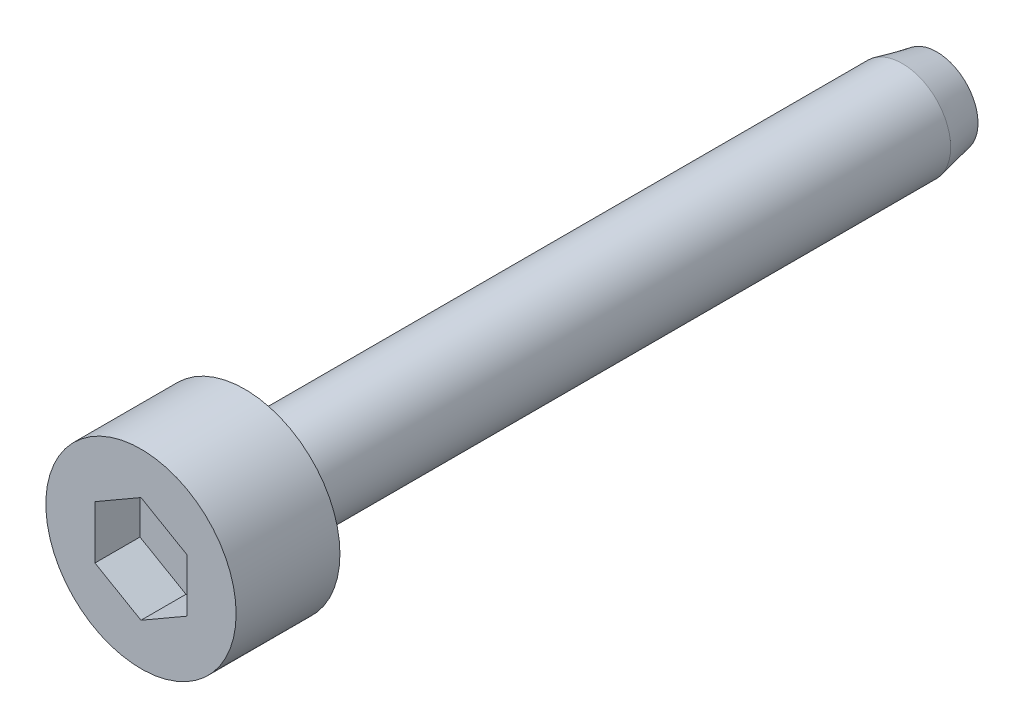
ISO-10303-21;
HEADER;
FILE_DESCRIPTION(('STEP AP214'),'2;1');
FILE_NAME('part.step','',(''),(''),'','','');
FILE_SCHEMA(('AUTOMOTIVE_DESIGN { 1 0 10303 214 1 1 1 1 }'));
ENDSEC;
DATA;
#1=APPLICATION_CONTEXT('core data for automotive mechanical design processes');
#2=APPLICATION_PROTOCOL_DEFINITION('international standard','automotive_design',2000,#1);
#3=PRODUCT_CONTEXT('',#1,'mechanical');
#4=PRODUCT('Part','Part','',(#3));
#5=PRODUCT_RELATED_PRODUCT_CATEGORY('part','',(#4));
#6=PRODUCT_DEFINITION_FORMATION('','',#4);
#7=PRODUCT_DEFINITION_CONTEXT('part definition',#1,'design');
#8=PRODUCT_DEFINITION('design','',#6,#7);
#9=PRODUCT_DEFINITION_SHAPE('','',#8);
#10=(LENGTH_UNIT() NAMED_UNIT(*) SI_UNIT(.MILLI.,.METRE.));
#11=(NAMED_UNIT(*) PLANE_ANGLE_UNIT() SI_UNIT($,.RADIAN.));
#12=(NAMED_UNIT(*) SI_UNIT($,.STERADIAN.) SOLID_ANGLE_UNIT());
#13=UNCERTAINTY_MEASURE_WITH_UNIT(LENGTH_MEASURE(1.E-05),#10,'distance_accuracy_value','');
#14=(GEOMETRIC_REPRESENTATION_CONTEXT(3) GLOBAL_UNCERTAINTY_ASSIGNED_CONTEXT((#13)) GLOBAL_UNIT_ASSIGNED_CONTEXT((#10,
#11,#12)) REPRESENTATION_CONTEXT('',''));
#15=CARTESIAN_POINT('',(0.,0.,0.));
#16=DIRECTION('',(0.,0.,1.));
#17=DIRECTION('',(1.,0.,0.));
#18=AXIS2_PLACEMENT_3D('',#15,#16,#17);
#19=CARTESIAN_POINT('',(0.,0.,-23.));
#20=DIRECTION('',(0.,0.,1.));
#21=DIRECTION('',(1.,0.,0.));
#22=AXIS2_PLACEMENT_3D('',#19,#20,#21);
#23=PLANE('',#22);
#24=CARTESIAN_POINT('',(0.,0.,-23.));
#25=DIRECTION('',(0.,0.,1.));
#26=DIRECTION('',(1.,0.,0.));
#27=AXIS2_PLACEMENT_3D('',#24,#25,#26);
#28=CIRCLE('',#27,1.19);
#29=CARTESIAN_POINT('',(1.19,0.,-23.));
#30=VERTEX_POINT('',#29);
#31=EDGE_CURVE('E10',#30,#30,#28,.T.);
#32=ORIENTED_EDGE('',*,*,#31,.F.);
#33=EDGE_LOOP('',(#32));
#34=FACE_BOUND('',#33,.T.);
#35=ADVANCED_FACE('F16',(#34),#23,.F.);
#36=CARTESIAN_POINT('',(0.,0.,-22.));
#37=DIRECTION('',(0.,0.,1.));
#38=DIRECTION('',(1.,0.,0.));
#39=AXIS2_PLACEMENT_3D('',#36,#37,#38);
#40=CONICAL_SURFACE('',#39,1.4,0.20699219422);
#41=DIRECTION('',(-0.205517234286012,0.,-0.978653496602055));
#42=VECTOR('',#41,1.);
#43=CARTESIAN_POINT('',(1.4,0.,-22.));
#44=LINE('',#43,#42);
#45=CARTESIAN_POINT('',(1.4,0.,-22.));
#46=VERTEX_POINT('',#45);
#47=EDGE_CURVE('E25',#46,#30,#44,.T.);
#48=ORIENTED_EDGE('',*,*,#47,.T.);
#49=ORIENTED_EDGE('',*,*,#31,.T.);
#50=ORIENTED_EDGE('',*,*,#47,.F.);
#51=CARTESIAN_POINT('',(0.,0.,-22.));
#52=DIRECTION('',(0.,0.,1.));
#53=DIRECTION('',(1.,0.,0.));
#54=AXIS2_PLACEMENT_3D('',#51,#52,#53);
#55=CIRCLE('',#54,1.4);
#56=EDGE_CURVE('E112',#46,#46,#55,.T.);
#57=ORIENTED_EDGE('',*,*,#56,.F.);
#58=EDGE_LOOP('',(#48,#49,#50,#57));
#59=FACE_BOUND('',#58,.T.);
#60=ADVANCED_FACE('F118',(#59),#40,.T.);
#61=CARTESIAN_POINT('',(0.,0.,-1.3));
#62=DIRECTION('',(0.,0.,1.));
#63=DIRECTION('',(1.,0.,0.));
#64=AXIS2_PLACEMENT_3D('',#61,#62,#63);
#65=PLANE('',#64);
#66=DIRECTION('',(-0.866025403784329,0.50000000000019,0.));
#67=VECTOR('',#66,1.);
#68=CARTESIAN_POINT('',(1.33,0.767875858022,-1.3));
#69=LINE('',#68,#67);
#70=CARTESIAN_POINT('',(1.33,0.767875858022,-1.3));
#71=VERTEX_POINT('',#70);
#72=CARTESIAN_POINT('',(0.,1.535751716044,-1.3));
#73=VERTEX_POINT('',#72);
#74=EDGE_CURVE('E195',#71,#73,#69,.T.);
#75=ORIENTED_EDGE('',*,*,#74,.T.);
#76=DIRECTION('',(-0.866025403784329,-0.50000000000019,0.));
#77=VECTOR('',#76,1.);
#78=CARTESIAN_POINT('',(0.,1.535751716044,-1.3));
#79=LINE('',#78,#77);
#80=CARTESIAN_POINT('',(-1.33,0.767875858022,-1.3));
#81=VERTEX_POINT('',#80);
#82=EDGE_CURVE('E176',#73,#81,#79,.T.);
#83=ORIENTED_EDGE('',*,*,#82,.T.);
#84=DIRECTION('',(0.,-1.,0.));
#85=VECTOR('',#84,1.);
#86=CARTESIAN_POINT('',(-1.33,0.767875858022,-1.3));
#87=LINE('',#86,#85);
#88=CARTESIAN_POINT('',(-1.33,-0.767875858022,-1.3));
#89=VERTEX_POINT('',#88);
#90=EDGE_CURVE('E133',#81,#89,#87,.T.);
#91=ORIENTED_EDGE('',*,*,#90,.T.);
#92=DIRECTION('',(0.866025403784329,-0.50000000000019,0.));
#93=VECTOR('',#92,1.);
#94=CARTESIAN_POINT('',(-1.33,-0.767875858022,-1.3));
#95=LINE('',#94,#93);
#96=CARTESIAN_POINT('',(0.,-1.535751716044,-1.3));
#97=VERTEX_POINT('',#96);
#98=EDGE_CURVE('E96',#89,#97,#95,.T.);
#99=ORIENTED_EDGE('',*,*,#98,.T.);
#100=DIRECTION('',(0.866025403784329,0.50000000000019,0.));
#101=VECTOR('',#100,1.);
#102=CARTESIAN_POINT('',(0.,-1.535751716044,-1.3));
#103=LINE('',#102,#101);
#104=CARTESIAN_POINT('',(1.33,-0.767875858022,-1.3));
#105=VERTEX_POINT('',#104);
#106=EDGE_CURVE('E72',#97,#105,#103,.T.);
#107=ORIENTED_EDGE('',*,*,#106,.T.);
#108=DIRECTION('',(0.,1.,0.));
#109=VECTOR('',#108,1.);
#110=CARTESIAN_POINT('',(1.33,-0.767875858022,-1.3));
#111=LINE('',#110,#109);
#112=EDGE_CURVE('E81',#105,#71,#111,.T.);
#113=ORIENTED_EDGE('',*,*,#112,.T.);
#114=EDGE_LOOP('',(#75,#83,#91,#99,#107,#113));
#115=FACE_BOUND('',#114,.T.);
#116=ADVANCED_FACE('F94',(#115),#65,.T.);
#117=CARTESIAN_POINT('',(0.,0.,-23.));
#118=DIRECTION('',(0.,0.,1.));
#119=DIRECTION('',(1.,0.,0.));
#120=AXIS2_PLACEMENT_3D('',#117,#118,#119);
#121=CYLINDRICAL_SURFACE('',#120,1.4);
#122=DIRECTION('',(0.,0.,1.));
#123=VECTOR('',#122,1.);
#124=CARTESIAN_POINT('',(1.4,0.,-23.));
#125=LINE('',#124,#123);
#126=CARTESIAN_POINT('',(1.4,0.,-3.));
#127=VERTEX_POINT('',#126);
#128=EDGE_CURVE('E92',#46,#127,#125,.T.);
#129=ORIENTED_EDGE('',*,*,#128,.T.);
#130=CARTESIAN_POINT('',(0.,0.,-3.));
#131=DIRECTION('',(0.,0.,1.));
#132=DIRECTION('',(1.,0.,0.));
#133=AXIS2_PLACEMENT_3D('',#130,#131,#132);
#134=CIRCLE('',#133,1.4);
#135=EDGE_CURVE('E124',#127,#127,#134,.T.);
#136=ORIENTED_EDGE('',*,*,#135,.F.);
#137=ORIENTED_EDGE('',*,*,#128,.F.);
#138=ORIENTED_EDGE('',*,*,#56,.T.);
#139=EDGE_LOOP('',(#129,#136,#137,#138));
#140=FACE_BOUND('',#139,.T.);
#141=ADVANCED_FACE('F121',(#140),#121,.T.);
#142=CARTESIAN_POINT('',(1.33,-0.767875858022,0.));
#143=DIRECTION('',(1.,0.,0.));
#144=DIRECTION('',(0.,1.,0.));
#145=AXIS2_PLACEMENT_3D('',#142,#143,#144);
#146=PLANE('',#145);
#147=DIRECTION('',(0.,1.,0.));
#148=VECTOR('',#147,1.);
#149=CARTESIAN_POINT('',(1.33,-0.767875858022,0.));
#150=LINE('',#149,#148);
#151=CARTESIAN_POINT('',(1.33,-0.767875858022,0.));
#152=VERTEX_POINT('',#151);
#153=CARTESIAN_POINT('',(1.33,0.767875858022,0.));
#154=VERTEX_POINT('',#153);
#155=EDGE_CURVE('E152',#152,#154,#150,.T.);
#156=ORIENTED_EDGE('',*,*,#155,.T.);
#157=DIRECTION('',(0.,0.,-1.));
#158=VECTOR('',#157,1.);
#159=CARTESIAN_POINT('',(1.33,0.767875858022,0.));
#160=LINE('',#159,#158);
#161=EDGE_CURVE('E87',#154,#71,#160,.T.);
#162=ORIENTED_EDGE('',*,*,#161,.T.);
#163=ORIENTED_EDGE('',*,*,#112,.F.);
#164=DIRECTION('',(0.,0.,-1.));
#165=VECTOR('',#164,1.);
#166=CARTESIAN_POINT('',(1.33,-0.767875858022,0.));
#167=LINE('',#166,#165);
#168=EDGE_CURVE('E84',#152,#105,#167,.T.);
#169=ORIENTED_EDGE('',*,*,#168,.F.);
#170=EDGE_LOOP('',(#156,#162,#163,#169));
#171=FACE_BOUND('',#170,.T.);
#172=ADVANCED_FACE('F83',(#171),#146,.F.);
#173=CARTESIAN_POINT('',(0.,-1.535751716044,0.));
#174=DIRECTION('',(0.50000000000019,-0.866025403784329,0.));
#175=DIRECTION('',(0.,0.,-1.));
#176=AXIS2_PLACEMENT_3D('',#173,#174,#175);
#177=PLANE('',#176);
#178=DIRECTION('',(0.866025403784329,0.50000000000019,0.));
#179=VECTOR('',#178,1.);
#180=CARTESIAN_POINT('',(0.,-1.535751716044,0.));
#181=LINE('',#180,#179);
#182=CARTESIAN_POINT('',(0.,-1.535751716044,0.));
#183=VERTEX_POINT('',#182);
#184=EDGE_CURVE('E102',#183,#152,#181,.T.);
#185=ORIENTED_EDGE('',*,*,#184,.T.);
#186=ORIENTED_EDGE('',*,*,#168,.T.);
#187=ORIENTED_EDGE('',*,*,#106,.F.);
#188=DIRECTION('',(0.,0.,-1.));
#189=VECTOR('',#188,1.);
#190=CARTESIAN_POINT('',(0.,-1.535751716044,0.));
#191=LINE('',#190,#189);
#192=EDGE_CURVE('E108',#183,#97,#191,.T.);
#193=ORIENTED_EDGE('',*,*,#192,.F.);
#194=EDGE_LOOP('',(#185,#186,#187,#193));
#195=FACE_BOUND('',#194,.T.);
#196=ADVANCED_FACE('F100',(#195),#177,.F.);
#197=CARTESIAN_POINT('',(-1.33,-0.767875858022,0.));
#198=DIRECTION('',(-0.50000000000019,-0.866025403784329,0.));
#199=DIRECTION('',(-0.866025403784329,0.50000000000019,0.));
#200=AXIS2_PLACEMENT_3D('',#197,#198,#199);
#201=PLANE('',#200);
#202=DIRECTION('',(0.866025403784329,-0.50000000000019,0.));
#203=VECTOR('',#202,1.);
#204=CARTESIAN_POINT('',(-1.33,-0.767875858022,0.));
#205=LINE('',#204,#203);
#206=CARTESIAN_POINT('',(-1.33,-0.767875858022,0.));
#207=VERTEX_POINT('',#206);
#208=EDGE_CURVE('E141',#207,#183,#205,.T.);
#209=ORIENTED_EDGE('',*,*,#208,.T.);
#210=ORIENTED_EDGE('',*,*,#192,.T.);
#211=ORIENTED_EDGE('',*,*,#98,.F.);
#212=DIRECTION('',(0.,0.,-1.));
#213=VECTOR('',#212,1.);
#214=CARTESIAN_POINT('',(-1.33,-0.767875858022,0.));
#215=LINE('',#214,#213);
#216=EDGE_CURVE('E134',#207,#89,#215,.T.);
#217=ORIENTED_EDGE('',*,*,#216,.F.);
#218=EDGE_LOOP('',(#209,#210,#211,#217));
#219=FACE_BOUND('',#218,.T.);
#220=ADVANCED_FACE('F139',(#219),#201,.F.);
#221=CARTESIAN_POINT('',(-1.33,0.767875858022,0.));
#222=DIRECTION('',(-1.,0.,0.));
#223=DIRECTION('',(0.,0.,1.));
#224=AXIS2_PLACEMENT_3D('',#221,#222,#223);
#225=PLANE('',#224);
#226=DIRECTION('',(0.,-1.,0.));
#227=VECTOR('',#226,1.);
#228=CARTESIAN_POINT('',(-1.33,0.767875858022,0.));
#229=LINE('',#228,#227);
#230=CARTESIAN_POINT('',(-1.33,0.767875858022,0.));
#231=VERTEX_POINT('',#230);
#232=EDGE_CURVE('E147',#231,#207,#229,.T.);
#233=ORIENTED_EDGE('',*,*,#232,.T.);
#234=ORIENTED_EDGE('',*,*,#216,.T.);
#235=ORIENTED_EDGE('',*,*,#90,.F.);
#236=DIRECTION('',(0.,0.,-1.));
#237=VECTOR('',#236,1.);
#238=CARTESIAN_POINT('',(-1.33,0.767875858022,0.));
#239=LINE('',#238,#237);
#240=EDGE_CURVE('E181',#231,#81,#239,.T.);
#241=ORIENTED_EDGE('',*,*,#240,.F.);
#242=EDGE_LOOP('',(#233,#234,#235,#241));
#243=FACE_BOUND('',#242,.T.);
#244=ADVANCED_FACE('F214',(#243),#225,.F.);
#245=CARTESIAN_POINT('',(0.,1.535751716044,0.));
#246=DIRECTION('',(-0.50000000000019,0.866025403784329,0.));
#247=DIRECTION('',(0.,0.,1.));
#248=AXIS2_PLACEMENT_3D('',#245,#246,#247);
#249=PLANE('',#248);
#250=DIRECTION('',(-0.866025403784329,-0.50000000000019,0.));
#251=VECTOR('',#250,1.);
#252=CARTESIAN_POINT('',(0.,1.535751716044,0.));
#253=LINE('',#252,#251);
#254=CARTESIAN_POINT('',(0.,1.535751716044,0.));
#255=VERTEX_POINT('',#254);
#256=EDGE_CURVE('E184',#255,#231,#253,.T.);
#257=ORIENTED_EDGE('',*,*,#256,.T.);
#258=ORIENTED_EDGE('',*,*,#240,.T.);
#259=ORIENTED_EDGE('',*,*,#82,.F.);
#260=DIRECTION('',(0.,0.,-1.));
#261=VECTOR('',#260,1.);
#262=CARTESIAN_POINT('',(0.,1.535751716044,0.));
#263=LINE('',#262,#261);
#264=EDGE_CURVE('E189',#255,#73,#263,.T.);
#265=ORIENTED_EDGE('',*,*,#264,.F.);
#266=EDGE_LOOP('',(#257,#258,#259,#265));
#267=FACE_BOUND('',#266,.T.);
#268=ADVANCED_FACE('F208',(#267),#249,.F.);
#269=CARTESIAN_POINT('',(1.33,0.767875858022,0.));
#270=DIRECTION('',(0.50000000000019,0.866025403784329,0.));
#271=DIRECTION('',(0.,0.,-1.));
#272=AXIS2_PLACEMENT_3D('',#269,#270,#271);
#273=PLANE('',#272);
#274=DIRECTION('',(-0.866025403784329,0.50000000000019,0.));
#275=VECTOR('',#274,1.);
#276=CARTESIAN_POINT('',(1.33,0.767875858022,0.));
#277=LINE('',#276,#275);
#278=EDGE_CURVE('E159',#154,#255,#277,.T.);
#279=ORIENTED_EDGE('',*,*,#278,.T.);
#280=ORIENTED_EDGE('',*,*,#264,.T.);
#281=ORIENTED_EDGE('',*,*,#74,.F.);
#282=ORIENTED_EDGE('',*,*,#161,.F.);
#283=EDGE_LOOP('',(#279,#280,#281,#282));
#284=FACE_BOUND('',#283,.T.);
#285=ADVANCED_FACE('F205',(#284),#273,.F.);
#286=CARTESIAN_POINT('',(0.,0.,-3.));
#287=DIRECTION('',(0.,0.,1.));
#288=DIRECTION('',(1.,0.,0.));
#289=AXIS2_PLACEMENT_3D('',#286,#287,#288);
#290=PLANE('',#289);
#291=ORIENTED_EDGE('',*,*,#135,.T.);
#292=EDGE_LOOP('',(#291));
#293=FACE_BOUND('',#292,.T.);
#294=CARTESIAN_POINT('',(0.,0.,-3.));
#295=DIRECTION('',(0.,0.,1.));
#296=DIRECTION('',(1.,0.,0.));
#297=AXIS2_PLACEMENT_3D('',#294,#295,#296);
#298=CIRCLE('',#297,2.75);
#299=CARTESIAN_POINT('',(2.75,0.,-3.));
#300=VERTEX_POINT('',#299);
#301=EDGE_CURVE('E168',#300,#300,#298,.T.);
#302=ORIENTED_EDGE('',*,*,#301,.F.);
#303=EDGE_LOOP('',(#302));
#304=FACE_BOUND('',#303,.T.);
#305=ADVANCED_FACE('F241',(#293,#304),#290,.F.);
#306=CARTESIAN_POINT('',(0.,0.,0.));
#307=DIRECTION('',(0.,0.,1.));
#308=DIRECTION('',(1.,0.,0.));
#309=AXIS2_PLACEMENT_3D('',#306,#307,#308);
#310=PLANE('',#309);
#311=ORIENTED_EDGE('',*,*,#278,.F.);
#312=ORIENTED_EDGE('',*,*,#155,.F.);
#313=ORIENTED_EDGE('',*,*,#184,.F.);
#314=ORIENTED_EDGE('',*,*,#208,.F.);
#315=ORIENTED_EDGE('',*,*,#232,.F.);
#316=ORIENTED_EDGE('',*,*,#256,.F.);
#317=EDGE_LOOP('',(#311,#312,#313,#314,#315,#316));
#318=FACE_BOUND('',#317,.T.);
#319=CARTESIAN_POINT('',(0.,0.,0.));
#320=DIRECTION('',(0.,0.,1.));
#321=DIRECTION('',(1.,0.,0.));
#322=AXIS2_PLACEMENT_3D('',#319,#320,#321);
#323=CIRCLE('',#322,2.75);
#324=CARTESIAN_POINT('',(2.75,0.,0.));
#325=VERTEX_POINT('',#324);
#326=EDGE_CURVE('E163',#325,#325,#323,.T.);
#327=ORIENTED_EDGE('',*,*,#326,.T.);
#328=EDGE_LOOP('',(#327));
#329=FACE_BOUND('',#328,.T.);
#330=ADVANCED_FACE('F150',(#318,#329),#310,.T.);
#331=CARTESIAN_POINT('',(0.,0.,-3.));
#332=DIRECTION('',(0.,0.,1.));
#333=DIRECTION('',(1.,0.,0.));
#334=AXIS2_PLACEMENT_3D('',#331,#332,#333);
#335=CYLINDRICAL_SURFACE('',#334,2.75);
#336=ORIENTED_EDGE('',*,*,#326,.F.);
#337=DIRECTION('',(0.,0.,1.));
#338=VECTOR('',#337,1.);
#339=CARTESIAN_POINT('',(2.75,0.,-3.));
#340=LINE('',#339,#338);
#341=EDGE_CURVE('E165',#300,#325,#340,.T.);
#342=ORIENTED_EDGE('',*,*,#341,.F.);
#343=ORIENTED_EDGE('',*,*,#301,.T.);
#344=ORIENTED_EDGE('',*,*,#341,.T.);
#345=EDGE_LOOP('',(#336,#342,#343,#344));
#346=FACE_BOUND('',#345,.T.);
#347=ADVANCED_FACE('F235',(#346),#335,.T.);
#348=CLOSED_SHELL('',(#35,#60,#116,#141,#172,#196,#220,#244,#268,#285,#305,#330,#347));
#349=MANIFOLD_SOLID_BREP('B1',#348);
#350=ADVANCED_BREP_SHAPE_REPRESENTATION('',(#18,#349),#14);
#351=SHAPE_DEFINITION_REPRESENTATION(#9,#350);
ENDSEC;
END-ISO-10303-21;
